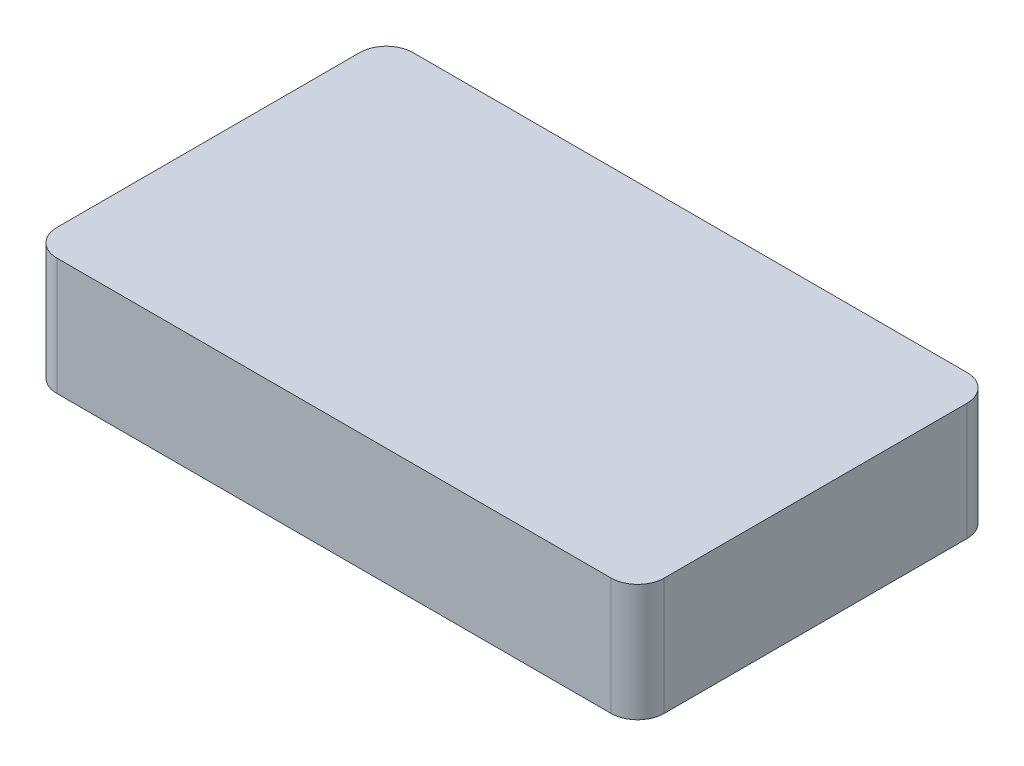
ISO-10303-21;
HEADER;
FILE_DESCRIPTION(('STEP AP214'),'2;1');
FILE_NAME('part.step','',(''),(''),'','','');
FILE_SCHEMA(('AUTOMOTIVE_DESIGN { 1 0 10303 214 1 1 1 1 }'));
ENDSEC;
DATA;
#1=APPLICATION_CONTEXT('core data for automotive mechanical design processes');
#2=APPLICATION_PROTOCOL_DEFINITION('international standard','automotive_design',2000,#1);
#3=PRODUCT_CONTEXT('',#1,'mechanical');
#4=PRODUCT('Part','Part','',(#3));
#5=PRODUCT_RELATED_PRODUCT_CATEGORY('part','',(#4));
#6=PRODUCT_DEFINITION_FORMATION('','',#4);
#7=PRODUCT_DEFINITION_CONTEXT('part definition',#1,'design');
#8=PRODUCT_DEFINITION('design','',#6,#7);
#9=PRODUCT_DEFINITION_SHAPE('','',#8);
#10=(LENGTH_UNIT() NAMED_UNIT(*) SI_UNIT(.MILLI.,.METRE.));
#11=(NAMED_UNIT(*) PLANE_ANGLE_UNIT() SI_UNIT($,.RADIAN.));
#12=(NAMED_UNIT(*) SI_UNIT($,.STERADIAN.) SOLID_ANGLE_UNIT());
#13=UNCERTAINTY_MEASURE_WITH_UNIT(LENGTH_MEASURE(1.E-05),#10,'distance_accuracy_value','');
#14=(GEOMETRIC_REPRESENTATION_CONTEXT(3) GLOBAL_UNCERTAINTY_ASSIGNED_CONTEXT((#13)) GLOBAL_UNIT_ASSIGNED_CONTEXT((#10,
#11,#12)) REPRESENTATION_CONTEXT('',''));
#15=CARTESIAN_POINT('',(0.,0.,0.));
#16=DIRECTION('',(0.,0.,1.));
#17=DIRECTION('',(1.,0.,0.));
#18=AXIS2_PLACEMENT_3D('',#15,#16,#17);
#19=CARTESIAN_POINT('',(66.150000034,28.,-36.150000037));
#20=DIRECTION('',(0.,-1.,0.));
#21=DIRECTION('',(0.,0.,-1.));
#22=AXIS2_PLACEMENT_3D('',#19,#20,#21);
#23=CYLINDRICAL_SURFACE('',#22,6.35);
#24=CARTESIAN_POINT('',(66.150000034,0.,-36.150000037));
#25=DIRECTION('',(0.,1.,0.));
#26=DIRECTION('',(0.,0.,-1.));
#27=AXIS2_PLACEMENT_3D('',#24,#25,#26);
#28=CIRCLE('',#27,6.35);
#29=CARTESIAN_POINT('',(72.500000034,0.,-36.150000037));
#30=VERTEX_POINT('',#29);
#31=CARTESIAN_POINT('',(66.150000034,0.,-42.500000037));
#32=VERTEX_POINT('',#31);
#33=EDGE_CURVE('E137',#30,#32,#28,.T.);
#34=ORIENTED_EDGE('',*,*,#33,.T.);
#35=DIRECTION('',(0.,-1.,0.));
#36=VECTOR('',#35,1.);
#37=CARTESIAN_POINT('',(66.150000034,28.,-42.500000037));
#38=LINE('',#37,#36);
#39=CARTESIAN_POINT('',(66.150000034,28.,-42.500000037));
#40=VERTEX_POINT('',#39);
#41=EDGE_CURVE('E11',#40,#32,#38,.T.);
#42=ORIENTED_EDGE('',*,*,#41,.F.);
#43=CARTESIAN_POINT('',(66.150000034,28.,-36.150000037));
#44=DIRECTION('',(0.,1.,0.));
#45=DIRECTION('',(0.,0.,-1.));
#46=AXIS2_PLACEMENT_3D('',#43,#44,#45);
#47=CIRCLE('',#46,6.35);
#48=CARTESIAN_POINT('',(72.500000034,28.,-36.150000037));
#49=VERTEX_POINT('',#48);
#50=EDGE_CURVE('E151',#49,#40,#47,.T.);
#51=ORIENTED_EDGE('',*,*,#50,.F.);
#52=DIRECTION('',(0.,-1.,0.));
#53=VECTOR('',#52,1.);
#54=CARTESIAN_POINT('',(72.500000034,28.,-36.150000037));
#55=LINE('',#54,#53);
#56=EDGE_CURVE('E133',#49,#30,#55,.T.);
#57=ORIENTED_EDGE('',*,*,#56,.T.);
#58=EDGE_LOOP('',(#34,#42,#51,#57));
#59=FACE_BOUND('',#58,.T.);
#60=ADVANCED_FACE('F41',(#59),#23,.T.);
#61=CARTESIAN_POINT('',(-66.1499999659999,28.,-42.500000037));
#62=DIRECTION('',(0.,0.,1.));
#63=DIRECTION('',(1.,0.,0.));
#64=AXIS2_PLACEMENT_3D('',#61,#62,#63);
#65=PLANE('',#64);
#66=DIRECTION('',(-1.,0.,0.));
#67=VECTOR('',#66,1.);
#68=CARTESIAN_POINT('',(-66.1499999659999,0.,-42.500000037));
#69=LINE('',#68,#67);
#70=CARTESIAN_POINT('',(-66.1499999659999,0.,-42.500000037));
#71=VERTEX_POINT('',#70);
#72=EDGE_CURVE('E140',#32,#71,#69,.T.);
#73=ORIENTED_EDGE('',*,*,#72,.T.);
#74=DIRECTION('',(0.,-1.,0.));
#75=VECTOR('',#74,1.);
#76=CARTESIAN_POINT('',(-66.1499999659999,28.,-42.500000037));
#77=LINE('',#76,#75);
#78=CARTESIAN_POINT('',(-66.1499999659999,28.,-42.500000037));
#79=VERTEX_POINT('',#78);
#80=EDGE_CURVE('E49',#79,#71,#77,.T.);
#81=ORIENTED_EDGE('',*,*,#80,.F.);
#82=DIRECTION('',(-1.,0.,0.));
#83=VECTOR('',#82,1.);
#84=CARTESIAN_POINT('',(-66.1499999659999,28.,-42.500000037));
#85=LINE('',#84,#83);
#86=EDGE_CURVE('E100',#40,#79,#85,.T.);
#87=ORIENTED_EDGE('',*,*,#86,.F.);
#88=ORIENTED_EDGE('',*,*,#41,.T.);
#89=EDGE_LOOP('',(#73,#81,#87,#88));
#90=FACE_BOUND('',#89,.T.);
#91=ADVANCED_FACE('F186',(#90),#65,.F.);
#92=CARTESIAN_POINT('',(-66.149999966,28.,-36.150000037));
#93=DIRECTION('',(0.,-1.,0.));
#94=DIRECTION('',(0.,0.,-1.));
#95=AXIS2_PLACEMENT_3D('',#92,#93,#94);
#96=CYLINDRICAL_SURFACE('',#95,6.35);
#97=CARTESIAN_POINT('',(-66.149999966,0.,-36.150000037));
#98=DIRECTION('',(0.,1.,0.));
#99=DIRECTION('',(0.,0.,1.));
#100=AXIS2_PLACEMENT_3D('',#97,#98,#99);
#101=CIRCLE('',#100,6.35);
#102=CARTESIAN_POINT('',(-72.499999966,0.,-36.150000037));
#103=VERTEX_POINT('',#102);
#104=EDGE_CURVE('E142',#71,#103,#101,.T.);
#105=ORIENTED_EDGE('',*,*,#104,.T.);
#106=DIRECTION('',(0.,-1.,0.));
#107=VECTOR('',#106,1.);
#108=CARTESIAN_POINT('',(-72.499999966,28.,-36.150000037));
#109=LINE('',#108,#107);
#110=CARTESIAN_POINT('',(-72.499999966,28.,-36.150000037));
#111=VERTEX_POINT('',#110);
#112=EDGE_CURVE('E158',#111,#103,#109,.T.);
#113=ORIENTED_EDGE('',*,*,#112,.F.);
#114=CARTESIAN_POINT('',(-66.149999966,28.,-36.150000037));
#115=DIRECTION('',(0.,1.,0.));
#116=DIRECTION('',(0.,0.,1.));
#117=AXIS2_PLACEMENT_3D('',#114,#115,#116);
#118=CIRCLE('',#117,6.35);
#119=EDGE_CURVE('E166',#79,#111,#118,.T.);
#120=ORIENTED_EDGE('',*,*,#119,.F.);
#121=ORIENTED_EDGE('',*,*,#80,.T.);
#122=EDGE_LOOP('',(#105,#113,#120,#121));
#123=FACE_BOUND('',#122,.T.);
#124=ADVANCED_FACE('F164',(#123),#96,.T.);
#125=CARTESIAN_POINT('',(-72.499999966,28.,-36.150000037));
#126=DIRECTION('',(1.,0.,0.));
#127=DIRECTION('',(0.,0.,-1.));
#128=AXIS2_PLACEMENT_3D('',#125,#126,#127);
#129=PLANE('',#128);
#130=DIRECTION('',(0.,0.,1.));
#131=VECTOR('',#130,1.);
#132=CARTESIAN_POINT('',(-72.499999966,0.,-36.150000037));
#133=LINE('',#132,#131);
#134=CARTESIAN_POINT('',(-72.499999966,0.,36.149999963));
#135=VERTEX_POINT('',#134);
#136=EDGE_CURVE('E144',#103,#135,#133,.T.);
#137=ORIENTED_EDGE('',*,*,#136,.T.);
#138=DIRECTION('',(0.,-1.,0.));
#139=VECTOR('',#138,1.);
#140=CARTESIAN_POINT('',(-72.499999966,28.,36.149999963));
#141=LINE('',#140,#139);
#142=CARTESIAN_POINT('',(-72.499999966,28.,36.149999963));
#143=VERTEX_POINT('',#142);
#144=EDGE_CURVE('E155',#143,#135,#141,.T.);
#145=ORIENTED_EDGE('',*,*,#144,.F.);
#146=DIRECTION('',(0.,0.,1.));
#147=VECTOR('',#146,1.);
#148=CARTESIAN_POINT('',(-72.499999966,28.,-36.150000037));
#149=LINE('',#148,#147);
#150=EDGE_CURVE('E178',#111,#143,#149,.T.);
#151=ORIENTED_EDGE('',*,*,#150,.F.);
#152=ORIENTED_EDGE('',*,*,#112,.T.);
#153=EDGE_LOOP('',(#137,#145,#151,#152));
#154=FACE_BOUND('',#153,.T.);
#155=ADVANCED_FACE('F174',(#154),#129,.F.);
#156=CARTESIAN_POINT('',(-66.149999966,28.,36.149999963));
#157=DIRECTION('',(0.,-1.,0.));
#158=DIRECTION('',(0.,0.,-1.));
#159=AXIS2_PLACEMENT_3D('',#156,#157,#158);
#160=CYLINDRICAL_SURFACE('',#159,6.35);
#161=CARTESIAN_POINT('',(-66.149999966,0.,36.149999963));
#162=DIRECTION('',(0.,1.,0.));
#163=DIRECTION('',(0.,0.,1.));
#164=AXIS2_PLACEMENT_3D('',#161,#162,#163);
#165=CIRCLE('',#164,6.35);
#166=CARTESIAN_POINT('',(-66.149999966,0.,42.499999963));
#167=VERTEX_POINT('',#166);
#168=EDGE_CURVE('E146',#135,#167,#165,.T.);
#169=ORIENTED_EDGE('',*,*,#168,.T.);
#170=DIRECTION('',(0.,-1.,0.));
#171=VECTOR('',#170,1.);
#172=CARTESIAN_POINT('',(-66.149999966,28.,42.499999963));
#173=LINE('',#172,#171);
#174=CARTESIAN_POINT('',(-66.149999966,28.,42.499999963));
#175=VERTEX_POINT('',#174);
#176=EDGE_CURVE('E128',#175,#167,#173,.T.);
#177=ORIENTED_EDGE('',*,*,#176,.F.);
#178=CARTESIAN_POINT('',(-66.149999966,28.,36.149999963));
#179=DIRECTION('',(0.,1.,0.));
#180=DIRECTION('',(0.,0.,1.));
#181=AXIS2_PLACEMENT_3D('',#178,#179,#180);
#182=CIRCLE('',#181,6.35);
#183=EDGE_CURVE('E119',#143,#175,#182,.T.);
#184=ORIENTED_EDGE('',*,*,#183,.F.);
#185=ORIENTED_EDGE('',*,*,#144,.T.);
#186=EDGE_LOOP('',(#169,#177,#184,#185));
#187=FACE_BOUND('',#186,.T.);
#188=ADVANCED_FACE('F177',(#187),#160,.T.);
#189=CARTESIAN_POINT('',(-66.1499999659999,28.,42.499999963));
#190=DIRECTION('',(0.,0.,-1.));
#191=DIRECTION('',(-1.,0.,0.));
#192=AXIS2_PLACEMENT_3D('',#189,#190,#191);
#193=PLANE('',#192);
#194=DIRECTION('',(1.,0.,0.));
#195=VECTOR('',#194,1.);
#196=CARTESIAN_POINT('',(-66.1499999659999,0.,42.499999963));
#197=LINE('',#196,#195);
#198=CARTESIAN_POINT('',(66.1500000339999,0.,42.499999963));
#199=VERTEX_POINT('',#198);
#200=EDGE_CURVE('E127',#167,#199,#197,.T.);
#201=ORIENTED_EDGE('',*,*,#200,.T.);
#202=DIRECTION('',(0.,-1.,0.));
#203=VECTOR('',#202,1.);
#204=CARTESIAN_POINT('',(66.1500000339999,28.,42.499999963));
#205=LINE('',#204,#203);
#206=CARTESIAN_POINT('',(66.1500000339999,28.,42.499999963));
#207=VERTEX_POINT('',#206);
#208=EDGE_CURVE('E124',#207,#199,#205,.T.);
#209=ORIENTED_EDGE('',*,*,#208,.F.);
#210=DIRECTION('',(1.,0.,0.));
#211=VECTOR('',#210,1.);
#212=CARTESIAN_POINT('',(-66.1499999659999,28.,42.499999963));
#213=LINE('',#212,#211);
#214=EDGE_CURVE('E113',#175,#207,#213,.T.);
#215=ORIENTED_EDGE('',*,*,#214,.F.);
#216=ORIENTED_EDGE('',*,*,#176,.T.);
#217=EDGE_LOOP('',(#201,#209,#215,#216));
#218=FACE_BOUND('',#217,.T.);
#219=ADVANCED_FACE('F125',(#218),#193,.F.);
#220=CARTESIAN_POINT('',(66.150000034,28.,36.149999963));
#221=DIRECTION('',(0.,-1.,0.));
#222=DIRECTION('',(0.,0.,-1.));
#223=AXIS2_PLACEMENT_3D('',#220,#221,#222);
#224=CYLINDRICAL_SURFACE('',#223,6.35);
#225=CARTESIAN_POINT('',(66.150000034,0.,36.149999963));
#226=DIRECTION('',(0.,1.,0.));
#227=DIRECTION('',(0.,0.,1.));
#228=AXIS2_PLACEMENT_3D('',#225,#226,#227);
#229=CIRCLE('',#228,6.35);
#230=CARTESIAN_POINT('',(72.500000034,0.,36.149999963));
#231=VERTEX_POINT('',#230);
#232=EDGE_CURVE('E86',#199,#231,#229,.T.);
#233=ORIENTED_EDGE('',*,*,#232,.T.);
#234=DIRECTION('',(0.,-1.,0.));
#235=VECTOR('',#234,1.);
#236=CARTESIAN_POINT('',(72.500000034,28.,36.149999963));
#237=LINE('',#236,#235);
#238=CARTESIAN_POINT('',(72.500000034,28.,36.149999963));
#239=VERTEX_POINT('',#238);
#240=EDGE_CURVE('E129',#239,#231,#237,.T.);
#241=ORIENTED_EDGE('',*,*,#240,.F.);
#242=CARTESIAN_POINT('',(66.150000034,28.,36.149999963));
#243=DIRECTION('',(0.,1.,0.));
#244=DIRECTION('',(0.,0.,1.));
#245=AXIS2_PLACEMENT_3D('',#242,#243,#244);
#246=CIRCLE('',#245,6.35);
#247=EDGE_CURVE('E117',#207,#239,#246,.T.);
#248=ORIENTED_EDGE('',*,*,#247,.F.);
#249=ORIENTED_EDGE('',*,*,#208,.T.);
#250=EDGE_LOOP('',(#233,#241,#248,#249));
#251=FACE_BOUND('',#250,.T.);
#252=ADVANCED_FACE('F131',(#251),#224,.T.);
#253=CARTESIAN_POINT('',(72.500000034,28.,-36.150000037));
#254=DIRECTION('',(-1.,0.,0.));
#255=DIRECTION('',(0.,0.,1.));
#256=AXIS2_PLACEMENT_3D('',#253,#254,#255);
#257=PLANE('',#256);
#258=DIRECTION('',(0.,0.,-1.));
#259=VECTOR('',#258,1.);
#260=CARTESIAN_POINT('',(72.500000034,0.,-36.150000037));
#261=LINE('',#260,#259);
#262=EDGE_CURVE('E92',#231,#30,#261,.T.);
#263=ORIENTED_EDGE('',*,*,#262,.T.);
#264=ORIENTED_EDGE('',*,*,#56,.F.);
#265=DIRECTION('',(0.,0.,-1.));
#266=VECTOR('',#265,1.);
#267=CARTESIAN_POINT('',(72.500000034,28.,-36.150000037));
#268=LINE('',#267,#266);
#269=EDGE_CURVE('E57',#239,#49,#268,.T.);
#270=ORIENTED_EDGE('',*,*,#269,.F.);
#271=ORIENTED_EDGE('',*,*,#240,.T.);
#272=EDGE_LOOP('',(#263,#264,#270,#271));
#273=FACE_BOUND('',#272,.T.);
#274=ADVANCED_FACE('F202',(#273),#257,.F.);
#275=CARTESIAN_POINT('',(66.150000034,28.,-36.150000037));
#276=DIRECTION('',(0.,-1.,0.));
#277=DIRECTION('',(0.,0.,-1.));
#278=AXIS2_PLACEMENT_3D('',#275,#276,#277);
#279=PLANE('',#278);
#280=ORIENTED_EDGE('',*,*,#50,.T.);
#281=ORIENTED_EDGE('',*,*,#86,.T.);
#282=ORIENTED_EDGE('',*,*,#119,.T.);
#283=ORIENTED_EDGE('',*,*,#150,.T.);
#284=ORIENTED_EDGE('',*,*,#183,.T.);
#285=ORIENTED_EDGE('',*,*,#214,.T.);
#286=ORIENTED_EDGE('',*,*,#247,.T.);
#287=ORIENTED_EDGE('',*,*,#269,.T.);
#288=EDGE_LOOP('',(#280,#281,#282,#283,#284,#285,#286,#287));
#289=FACE_BOUND('',#288,.T.);
#290=ADVANCED_FACE('F115',(#289),#279,.F.);
#291=CARTESIAN_POINT('',(66.150000034,0.,-36.150000037));
#292=DIRECTION('',(0.,-1.,0.));
#293=DIRECTION('',(0.,0.,-1.));
#294=AXIS2_PLACEMENT_3D('',#291,#292,#293);
#295=PLANE('',#294);
#296=ORIENTED_EDGE('',*,*,#33,.F.);
#297=ORIENTED_EDGE('',*,*,#262,.F.);
#298=ORIENTED_EDGE('',*,*,#232,.F.);
#299=ORIENTED_EDGE('',*,*,#200,.F.);
#300=ORIENTED_EDGE('',*,*,#168,.F.);
#301=ORIENTED_EDGE('',*,*,#136,.F.);
#302=ORIENTED_EDGE('',*,*,#104,.F.);
#303=ORIENTED_EDGE('',*,*,#72,.F.);
#304=EDGE_LOOP('',(#296,#297,#298,#299,#300,#301,#302,#303));
#305=FACE_BOUND('',#304,.T.);
#306=ADVANCED_FACE('F170',(#305),#295,.T.);
#307=CLOSED_SHELL('',(#60,#91,#124,#155,#188,#219,#252,#274,#290,#306));
#308=MANIFOLD_SOLID_BREP('B2',#307);
#309=ADVANCED_BREP_SHAPE_REPRESENTATION('',(#18,#308),#14);
#310=SHAPE_DEFINITION_REPRESENTATION(#9,#309);
ENDSEC;
END-ISO-10303-21;
